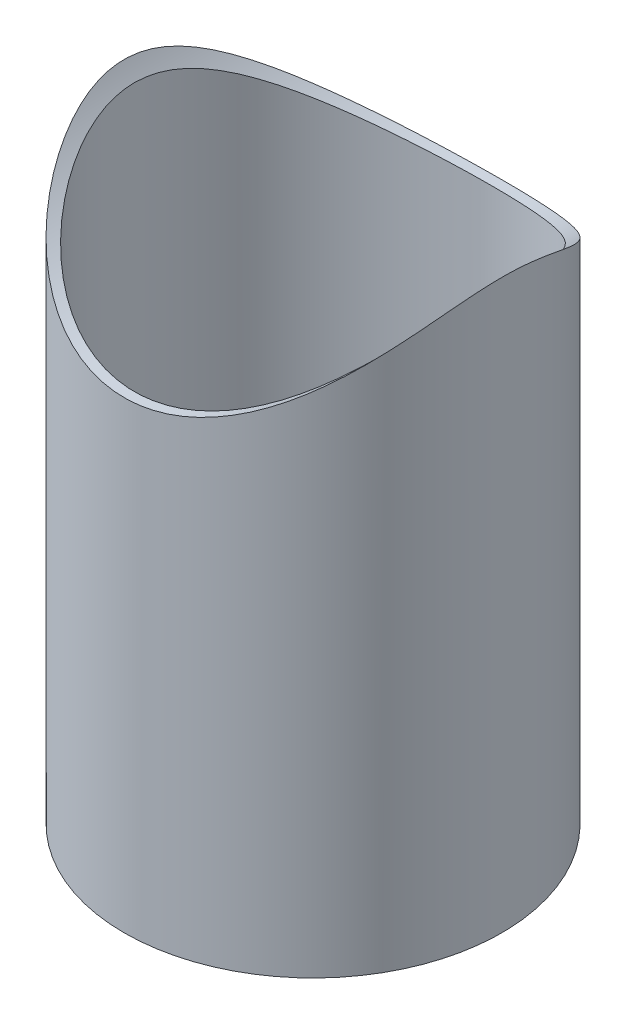
ISO-10303-21;
HEADER;
FILE_DESCRIPTION(('STEP AP214'),'2;1');
FILE_NAME('part.step','',(''),(''),'','','');
FILE_SCHEMA(('AUTOMOTIVE_DESIGN { 1 0 10303 214 1 1 1 1 }'));
ENDSEC;
DATA;
#1=APPLICATION_CONTEXT('core data for automotive mechanical design processes');
#2=APPLICATION_PROTOCOL_DEFINITION('international standard','automotive_design',2000,#1);
#3=PRODUCT_CONTEXT('',#1,'mechanical');
#4=PRODUCT('Part','Part','',(#3));
#5=PRODUCT_RELATED_PRODUCT_CATEGORY('part','',(#4));
#6=PRODUCT_DEFINITION_FORMATION('','',#4);
#7=PRODUCT_DEFINITION_CONTEXT('part definition',#1,'design');
#8=PRODUCT_DEFINITION('design','',#6,#7);
#9=PRODUCT_DEFINITION_SHAPE('','',#8);
#10=(LENGTH_UNIT() NAMED_UNIT(*) SI_UNIT(.MILLI.,.METRE.));
#11=(NAMED_UNIT(*) PLANE_ANGLE_UNIT() SI_UNIT($,.RADIAN.));
#12=(NAMED_UNIT(*) SI_UNIT($,.STERADIAN.) SOLID_ANGLE_UNIT());
#13=UNCERTAINTY_MEASURE_WITH_UNIT(LENGTH_MEASURE(1.E-05),#10,'distance_accuracy_value','');
#14=(GEOMETRIC_REPRESENTATION_CONTEXT(3) GLOBAL_UNCERTAINTY_ASSIGNED_CONTEXT((#13)) GLOBAL_UNIT_ASSIGNED_CONTEXT((#10,
#11,#12)) REPRESENTATION_CONTEXT('',''));
#15=CARTESIAN_POINT('',(0.,0.,0.));
#16=DIRECTION('',(0.,0.,1.));
#17=DIRECTION('',(1.,0.,0.));
#18=AXIS2_PLACEMENT_3D('',#15,#16,#17);
#19=CARTESIAN_POINT('',(0.,200.,0.));
#20=DIRECTION('',(0.,-1.,0.));
#21=DIRECTION('',(0.,0.,-1.));
#22=AXIS2_PLACEMENT_3D('',#19,#20,#21);
#23=CYLINDRICAL_SURFACE('',#22,55.);
#24=CARTESIAN_POINT('',(0.,135.,-55.));
#25=CARTESIAN_POINT('',(0.649687984992987,134.999999930929,-55.0000000926449));
#26=CARTESIAN_POINT('',(1.29938341036194,135.009745585915,-54.9884835203489));
#27=CARTESIAN_POINT('',(2.59745079891205,135.048672604591,-54.942470642494));
#28=CARTESIAN_POINT('',(3.24582259036104,135.077856347155,-54.9079715242826));
#29=CARTESIAN_POINT('',(4.54001614705967,135.155504198764,-54.8161402980721));
#30=CARTESIAN_POINT('',(5.18583694312795,135.203975034706,-54.7588002236633));
#31=CARTESIAN_POINT('',(6.47342844229795,135.319920873904,-54.6215523570628));
#32=CARTESIAN_POINT('',(7.11519867716309,135.387398034557,-54.5416420029301));
#33=CARTESIAN_POINT('',(8.39437292394328,135.541097792042,-54.359474564406));
#34=CARTESIAN_POINT('',(9.0317682718971,135.627350310001,-54.2571818091987));
#35=CARTESIAN_POINT('',(10.299951578349,135.818051920441,-54.0307889340309));
#36=CARTESIAN_POINT('',(10.9307387929352,135.922503038785,-53.906686386197));
#37=CARTESIAN_POINT('',(12.811174199476,136.262296770625,-53.5024888777877));
#38=CARTESIAN_POINT('',(14.0494127963205,136.52414245144,-53.1904299493305));
#39=CARTESIAN_POINT('',(16.4785655768544,137.111137040586,-52.488530074335));
#40=CARTESIAN_POINT('',(17.6697381288622,137.43585681733,-52.0992159895204));
#41=CARTESIAN_POINT('',(20.0074466137368,138.14376804308,-51.2469486702097));
#42=CARTESIAN_POINT('',(21.1539824507714,138.526959617613,-50.7839952776255));
#43=CARTESIAN_POINT('',(23.3975292137013,139.34539073535,-49.7901704326261));
#44=CARTESIAN_POINT('',(24.4945487383163,139.780621193507,-49.2593108342782));
#45=CARTESIAN_POINT('',(26.6363547136821,140.696867486587,-48.1348918281424));
#46=CARTESIAN_POINT('',(27.6811298604858,141.177893165255,-47.5413189370225));
#47=CARTESIAN_POINT('',(29.3977400828417,142.022586149458,-46.4913428188428));
#48=CARTESIAN_POINT('',(30.0840417422323,142.375921134588,-46.050080547211));
#49=CARTESIAN_POINT('',(31.4303032486224,143.099036362002,-45.1419441062798));
#50=CARTESIAN_POINT('',(32.0902686091924,143.468813127522,-44.6750753468759));
#51=CARTESIAN_POINT('',(33.3839557976297,144.223012911788,-43.7168130731633));
#52=CARTESIAN_POINT('',(34.0176672594633,144.607441602789,-43.2254100375151));
#53=CARTESIAN_POINT('',(35.2584026818911,145.388803308988,-42.2194618594444));
#54=CARTESIAN_POINT('',(35.8654251439838,145.785737024161,-41.7049154208672));
#55=CARTESIAN_POINT('',(37.6492906960693,146.994376034597,-40.1255275508804));
#56=CARTESIAN_POINT('',(38.7860232104076,147.822206733439,-39.0271006703234));
#57=CARTESIAN_POINT('',(40.4100650641436,149.083429158116,-37.3181487498578));
#58=CARTESIAN_POINT('',(40.9379267193561,149.507103913498,-36.7382496198527));
#59=CARTESIAN_POINT('',(41.9668390292239,150.358986664023,-35.5583603711605));
#60=CARTESIAN_POINT('',(42.4678922176131,150.78719422616,-34.9583721598866));
#61=CARTESIAN_POINT('',(43.4526833086036,151.654336825908,-33.726814994887));
#62=CARTESIAN_POINT('',(43.9358950453101,152.093318547677,-33.0948588099637));
#63=CARTESIAN_POINT('',(44.8744648399211,152.971335152551,-31.8106107365733));
#64=CARTESIAN_POINT('',(45.3298227076239,153.410370035999,-31.1583187092878));
#65=CARTESIAN_POINT('',(46.2127327916096,154.285997680627,-29.8331604723272));
#66=CARTESIAN_POINT('',(46.6402753685946,154.722589547784,-29.1602872478168));
#67=CARTESIAN_POINT('',(47.4671758869425,155.59024515978,-27.7939717517379));
#68=CARTESIAN_POINT('',(47.8665341707893,156.021308971741,-27.1005297302585));
#69=CARTESIAN_POINT('',(48.6358647342957,156.873656688436,-25.6942333500024));
#70=CARTESIAN_POINT('',(49.0059005541708,157.294960257416,-24.9814257254015));
#71=CARTESIAN_POINT('',(49.7170595949343,158.125035371515,-23.5343154253339));
#72=CARTESIAN_POINT('',(50.0581812777678,158.533806249234,-22.8000116091932));
#73=CARTESIAN_POINT('',(50.7104972297632,159.334144999828,-21.309776784882));
#74=CARTESIAN_POINT('',(51.0217122020373,159.725724669934,-20.5538612148442));
#75=CARTESIAN_POINT('',(51.613374355413,160.486813862848,-19.0193495138553));
#76=CARTESIAN_POINT('',(51.8938270788582,160.856327355771,-18.2407575005472));
#77=CARTESIAN_POINT('',(52.4420927793597,161.593579934061,-16.6020262483409));
#78=CARTESIAN_POINT('',(52.7074600229864,161.959190692151,-15.7401004372349));
#79=CARTESIAN_POINT('',(53.1989739601385,162.649647750257,-13.9891316590003));
#80=CARTESIAN_POINT('',(53.4251255872957,162.974499176692,-13.1000921195634));
#81=CARTESIAN_POINT('',(53.8351576182025,163.57326024105,-11.2972776318347));
#82=CARTESIAN_POINT('',(54.0191185232752,163.84726669883,-10.3835535713789));
#83=CARTESIAN_POINT('',(54.3422959516675,164.334881390968,-8.53215030107312));
#84=CARTESIAN_POINT('',(54.4815124789616,164.548489630691,-7.59447109335102));
#85=CARTESIAN_POINT('',(54.7138036053771,164.908027574049,-5.68645934289734));
#86=CARTESIAN_POINT('',(54.8061998303719,165.052960402583,-4.71585279632698));
#87=CARTESIAN_POINT('',(54.93930081178,165.262571537931,-2.76245509336314));
#88=CARTESIAN_POINT('',(54.9800116318612,165.327259258982,-1.77966537994677));
#89=CARTESIAN_POINT('',(55.0084751638515,165.372432139168,0.188196653923133));
#90=CARTESIAN_POINT('',(54.9962525941352,165.35295660014,1.17326769431656));
#91=CARTESIAN_POINT('',(54.9192994461694,165.231112810195,3.1361893184346));
#92=CARTESIAN_POINT('',(54.8545634871348,165.128736064806,4.11403915187661));
#93=CARTESIAN_POINT('',(54.6703336470178,164.840578199356,6.09864737348195));
#94=CARTESIAN_POINT('',(54.5484417716551,164.651152682689,7.10464615367857));
#95=CARTESIAN_POINT('',(54.2526133447842,164.198791761486,9.09197095388173));
#96=CARTESIAN_POINT('',(54.0786702422936,163.935847104366,10.0732938514072));
#97=CARTESIAN_POINT('',(53.681868308189,163.347811328419,12.0098748794838));
#98=CARTESIAN_POINT('',(53.4588716858674,163.022545488974,12.9650508908919));
#99=CARTESIAN_POINT('',(52.9675718902619,162.322165966914,14.8452369191923));
#100=CARTESIAN_POINT('',(52.6992503428288,161.947032081618,15.7702345199656));
#101=CARTESIAN_POINT('',(52.1753075903611,161.232816334555,17.416510886191));
#102=CARTESIAN_POINT('',(51.9269782429803,160.900449014116,18.1430731434705));
#103=CARTESIAN_POINT('',(51.4037620570903,160.215090481265,19.5763927736807));
#104=CARTESIAN_POINT('',(51.1288811392323,159.86210387359,20.2831545167287));
#105=CARTESIAN_POINT('',(50.5532776312992,159.139509797424,21.6780011873878));
#106=CARTESIAN_POINT('',(50.2525383598995,158.769891674273,22.3660736761737));
#107=CARTESIAN_POINT('',(49.626065791255,158.017943152456,23.7236695734822));
#108=CARTESIAN_POINT('',(49.3003311016431,157.635612046289,24.3931919458409));
#109=CARTESIAN_POINT('',(48.623949596075,156.860965505391,25.7150434134017));
#110=CARTESIAN_POINT('',(48.2732697850259,156.468637304496,26.367348111174));
#111=CARTESIAN_POINT('',(47.5477619556378,155.677336742454,27.6542205087475));
#112=CARTESIAN_POINT('',(47.1729344040535,155.278364509841,28.2887885510431));
#113=CARTESIAN_POINT('',(46.399469689379,154.476385242909,29.5403147812793));
#114=CARTESIAN_POINT('',(46.0008389391666,154.073379319453,30.1572776466657));
#115=CARTESIAN_POINT('',(45.1797811590967,153.265439388125,31.3739706626308));
#116=CARTESIAN_POINT('',(44.7573517856633,152.860505193973,31.9736991072328));
#117=CARTESIAN_POINT('',(43.8602980018059,152.024229662052,33.1946556623467));
#118=CARTESIAN_POINT('',(43.3840675279777,151.592899133041,33.8147121484806));
#119=CARTESIAN_POINT('',(42.4047229512643,150.732726396931,35.0350041044574));
#120=CARTESIAN_POINT('',(41.9016088745786,150.303884187407,35.6352395936161));
#121=CARTESIAN_POINT('',(40.8683954603829,149.450784835718,36.8156153527884));
#122=CARTESIAN_POINT('',(40.3382921511321,149.026528379594,37.3957526439151));
#123=CARTESIAN_POINT('',(39.251123108983,148.184732069061,38.5353014680411));
#124=CARTESIAN_POINT('',(38.6940569924405,147.767192310332,39.0947127059368));
#125=CARTESIAN_POINT('',(37.5538512398668,146.941514168012,40.1912033942878));
#126=CARTESIAN_POINT('',(36.9707546594091,146.533361836648,40.7283170784991));
#127=CARTESIAN_POINT('',(35.7777120485169,145.727784486295,41.7802315188984));
#128=CARTESIAN_POINT('',(35.1677677665009,145.33035877146,42.2950337237692));
#129=CARTESIAN_POINT('',(33.9212598377917,144.548316024042,43.301147644347));
#130=CARTESIAN_POINT('',(33.2847049938593,144.163694830185,43.7924670146817));
#131=CARTESIAN_POINT('',(31.9848331575292,143.409051402836,44.7506715651381));
#132=CARTESIAN_POINT('',(31.3215095796636,143.039032806611,45.2175506669276));
#133=CARTESIAN_POINT('',(29.5748824279636,142.105282442182,46.3895121752436));
#134=CARTESIAN_POINT('',(28.4717044772346,141.554056530097,47.0751981373403));
#135=CARTESIAN_POINT('',(26.2014937508764,140.501713446293,48.3755294445427));
#136=CARTESIAN_POINT('',(25.0344753087917,140.000585097471,48.9901906405428));
#137=CARTESIAN_POINT('',(23.2388988121384,139.292768879571,49.8537359081388));
#138=CARTESIAN_POINT('',(22.6328324425032,139.064132094982,50.1318562030298));
#139=CARTESIAN_POINT('',(21.4062493829657,138.622502846132,50.6677433597635));
#140=CARTESIAN_POINT('',(20.7857350314801,138.409507873096,50.9255134860492));
#141=CARTESIAN_POINT('',(19.530828287219,138.00014168566,51.4198563270945));
#142=CARTESIAN_POINT('',(18.8964341148236,137.803772618878,51.6564263035968));
#143=CARTESIAN_POINT('',(17.6146918276211,137.428692812162,52.1074290720417));
#144=CARTESIAN_POINT('',(16.9673440188875,137.249981655591,52.3218623863024));
#145=CARTESIAN_POINT('',(15.654721556041,136.909639788761,52.7295577662699));
#146=CARTESIAN_POINT('',(14.9893374585955,136.748179031837,52.9226097589647));
#147=CARTESIAN_POINT('',(13.6476076331259,136.445175338578,53.2843833056507));
#148=CARTESIAN_POINT('',(12.9712634990334,136.303629534468,53.4531083628331));
#149=CARTESIAN_POINT('',(11.6087011253588,136.041267398405,53.7654783611025));
#150=CARTESIAN_POINT('',(10.9224812874604,135.920454463765,53.9091191919235));
#151=CARTESIAN_POINT('',(9.54179537039117,135.700367392421,54.1705430062947));
#152=CARTESIAN_POINT('',(8.84733034600363,135.601090531324,54.2883292605659));
#153=CARTESIAN_POINT('',(7.4520684462637,135.424766326592,54.4973756791653));
#154=CARTESIAN_POINT('',(6.75127587675071,135.347704891653,54.5886526586699));
#155=CARTESIAN_POINT('',(5.34468328314211,135.216257730787,54.7442690621251));
#156=CARTESIAN_POINT('',(4.63888393041409,135.161869020981,54.8086120307724));
#157=CARTESIAN_POINT('',(3.22395348656202,135.076134278249,54.9100089401845));
#158=CARTESIAN_POINT('',(2.514822573013,135.044787030907,54.9470643191603));
#159=CARTESIAN_POINT('',(1.09508649550507,135.005343571329,54.9936858897516));
#160=CARTESIAN_POINT('',(0.38448138634033,134.997246509874,55.0032530853804));
#161=CARTESIAN_POINT('',(-1.5505259796771,135.006972191135,54.9917619221442));
#162=CARTESIAN_POINT('',(-2.77483786266464,135.047775708681,54.9435505627072));
#163=CARTESIAN_POINT('',(-5.21301850443081,135.197863476363,54.7660394944585));
#164=CARTESIAN_POINT('',(-6.42688840173863,135.307140162157,54.6367487426165));
#165=CARTESIAN_POINT('',(-8.83572258046039,135.591919847431,54.2992540584982));
#166=CARTESIAN_POINT('',(-10.0306867168894,135.767423354536,54.0910495213516));
#167=CARTESIAN_POINT('',(-12.3938100387912,136.181251211939,53.5989776180277));
#168=CARTESIAN_POINT('',(-13.5619681231911,136.419578137737,53.3151071498528));
#169=CARTESIAN_POINT('',(-15.8516450002449,136.951674976446,52.6794188512357));
#170=CARTESIAN_POINT('',(-16.9735424802315,137.24478546446,52.3284081139334));
#171=CARTESIAN_POINT('',(-19.1792106645202,137.883366467024,51.5608523514634));
#172=CARTESIAN_POINT('',(-20.2629828971563,138.228834879738,51.1443099569471));
#173=CARTESIAN_POINT('',(-22.3885664671887,138.967071796699,50.2501935293978));
#174=CARTESIAN_POINT('',(-23.4303694540098,139.35984965263,49.772607428675));
#175=CARTESIAN_POINT('',(-25.4690524018154,140.187476893335,48.7608718676468));
#176=CARTESIAN_POINT('',(-26.46592324301,140.622334763146,48.2267109975134));
#177=CARTESIAN_POINT('',(-28.1385962148448,141.401237609576,47.2638439695312));
#178=CARTESIAN_POINT('',(-28.8258480273699,141.736427795638,46.8477290717021));
#179=CARTESIAN_POINT('',(-30.1753144713023,142.423756839421,45.9901017076533));
#180=CARTESIAN_POINT('',(-30.8375336778769,142.775892573028,45.5485939200079));
#181=CARTESIAN_POINT('',(-32.7868080540558,143.855266308104,44.1875270916915));
#182=CARTESIAN_POINT('',(-34.0361863392249,144.605332676025,43.2315945696784));
#183=CARTESIAN_POINT('',(-36.4348734516364,146.152597828423,41.2304072446877));
#184=CARTESIAN_POINT('',(-37.583951182396,146.949898704309,40.1849566155335));
#185=CARTESIAN_POINT('',(-39.7790725030482,148.575403082736,38.0132694917532));
#186=CARTESIAN_POINT('',(-40.8251287347363,149.403602776434,36.8870429385477));
#187=CARTESIAN_POINT('',(-42.3261520972851,150.665071802552,35.1298268672946));
#188=CARTESIAN_POINT('',(-42.8193025026823,151.092725738569,34.5269877798857));
#189=CARTESIAN_POINT('',(-43.7789733957533,151.949868090205,33.3017569484235));
#190=CARTESIAN_POINT('',(-44.2454958257804,152.379356369556,32.679366635664));
#191=CARTESIAN_POINT('',(-45.1520108434491,153.237987375309,31.4149841408783));
#192=CARTESIAN_POINT('',(-45.5919956356156,153.66712996399,30.7729862817256));
#193=CARTESIAN_POINT('',(-46.4451858393746,154.522428221674,29.4695006037013));
#194=CARTESIAN_POINT('',(-46.8583914934964,154.948583917697,28.8080129614208));
#195=CARTESIAN_POINT('',(-47.6571915924121,155.79445806324,27.466355585513));
#196=CARTESIAN_POINT('',(-48.0428279862442,156.214185494698,26.7862165120752));
#197=CARTESIAN_POINT('',(-48.7868620792168,157.044756627082,25.405843437986));
#198=CARTESIAN_POINT('',(-49.1452587284877,157.455599985164,24.705608664241));
#199=CARTESIAN_POINT('',(-49.8340976107132,158.264586187344,23.2848801729695));
#200=CARTESIAN_POINT('',(-50.1645540812911,158.662735434823,22.5643970259658));
#201=CARTESIAN_POINT('',(-50.7969262302645,159.442334970467,21.1022892842927));
#202=CARTESIAN_POINT('',(-51.0988456153796,159.823787423934,20.3606674516876));
#203=CARTESIAN_POINT('',(-51.7173095281613,160.622184537481,18.7398896858691));
#204=CARTESIAN_POINT('',(-52.0289788270785,161.035582798757,17.8571038109098));
#205=CARTESIAN_POINT('',(-52.6109728454683,161.825059452033,16.0616301570104));
#206=CARTESIAN_POINT('',(-52.8813001463813,162.201140173667,15.1489442493863));
#207=CARTESIAN_POINT('',(-53.3775125160622,162.905170293515,13.2951190093294));
#208=CARTESIAN_POINT('',(-53.6034730580087,163.233201184466,12.3540311951137));
#209=CARTESIAN_POINT('',(-54.008238391197,163.830391179439,10.4433274066731));
#210=CARTESIAN_POINT('',(-54.1870518548593,164.099561109023,9.47371671558427));
#211=CARTESIAN_POINT('',(-54.4698306123508,164.530390604502,7.66414578022683));
#212=CARTESIAN_POINT('',(-54.5811453042148,164.702301664104,6.82778490106962));
#213=CARTESIAN_POINT('',(-54.7657506558717,164.989403348471,5.14118932334446));
#214=CARTESIAN_POINT('',(-54.8390458744327,165.104600773465,4.29095630074767));
#215=CARTESIAN_POINT('',(-54.9459799610312,165.273218120098,2.58276928660831));
#216=CARTESIAN_POINT('',(-54.9796619840547,165.326705268281,1.72482472511913));
#217=CARTESIAN_POINT('',(-55.0067096189903,165.36962916057,0.00666642298614568));
#218=CARTESIAN_POINT('',(-55.0000748908792,165.359065364482,-0.853547336734438));
#219=CARTESIAN_POINT('',(-54.9466733987578,165.274425852963,-2.56881163233851));
#220=CARTESIAN_POINT('',(-54.8999406933183,165.200404037787,-3.42386593006711));
#221=CARTESIAN_POINT('',(-54.7674781487508,164.99230948769,-5.12348714163929));
#222=CARTESIAN_POINT('',(-54.6817475448538,164.858235575117,-5.9680538494821));
#223=CARTESIAN_POINT('',(-54.4728840752113,164.535345486281,-7.64320612441843));
#224=CARTESIAN_POINT('',(-54.3496936416962,164.346445073862,-8.47376808093944));
#225=CARTESIAN_POINT('',(-54.0680504051632,163.920767612295,-10.1163576822999));
#226=CARTESIAN_POINT('',(-53.9095927256599,163.683983942629,-10.9283827468628));
#227=CARTESIAN_POINT('',(-53.4575610341473,163.019859153099,-12.9990617462658));
#228=CARTESIAN_POINT('',(-53.1390341547452,162.561837597344,-14.2424859336938));
#229=CARTESIAN_POINT('',(-52.4262467228865,161.570043449388,-16.6763024617869));
#230=CARTESIAN_POINT('',(-52.0319392497618,161.036223979557,-17.8666613808192));
#231=CARTESIAN_POINT('',(-51.1717387684896,159.913153950216,-20.1990825111066));
#232=CARTESIAN_POINT('',(-50.7056184306942,159.323729750313,-21.3409761249403));
#233=CARTESIAN_POINT('',(-49.706435579245,158.10860460565,-23.5747161170811));
#234=CARTESIAN_POINT('',(-49.1733787944352,157.482906767881,-24.6665667674781));
#235=CARTESIAN_POINT('',(-48.1961471569936,156.38215001142,-26.5123686431482));
#236=CARTESIAN_POINT('',(-47.7671451825292,155.912325072692,-27.2775621634224));
#237=CARTESIAN_POINT('',(-46.8752438935084,154.965185117021,-28.7832814799057));
#238=CARTESIAN_POINT('',(-46.4123419139283,154.487869513526,-29.5238053300548));
#239=CARTESIAN_POINT('',(-45.452790339795,153.529537154047,-30.9807190966422));
#240=CARTESIAN_POINT('',(-44.9561271529625,153.048518977346,-31.6970991170596));
#241=CARTESIAN_POINT('',(-43.9293648994323,152.086475342967,-33.1054417482998));
#242=CARTESIAN_POINT('',(-43.3992667569676,151.605449885858,-33.7974050332437));
#243=CARTESIAN_POINT('',(-42.3063119171219,150.647152272291,-35.1558674440198));
#244=CARTESIAN_POINT('',(-41.7434956708736,150.169876275784,-35.8223963943522));
#245=CARTESIAN_POINT('',(-40.5844785137557,149.221452792438,-37.130360007689));
#246=CARTESIAN_POINT('',(-39.9882769100143,148.750305433043,-37.7717941494122));
#247=CARTESIAN_POINT('',(-38.7626893892383,147.817178851585,-39.0285008183889));
#248=CARTESIAN_POINT('',(-38.1333173890136,147.355195894777,-39.6437841246873));
#249=CARTESIAN_POINT('',(-36.8411543144454,146.442974588028,-40.8473867749349));
#250=CARTESIAN_POINT('',(-36.1783620127959,145.992736670327,-41.4357051271235));
#251=CARTESIAN_POINT('',(-34.4525258180371,144.867586709047,-42.8940535632524));
#252=CARTESIAN_POINT('',(-33.3665098624788,144.202551772391,-43.7447736603054));
#253=CARTESIAN_POINT('',(-31.1160894128394,142.917005321406,-45.3730943051902));
#254=CARTESIAN_POINT('',(-29.9516879258718,142.29649210097,-46.1506976552685));
#255=CARTESIAN_POINT('',(-27.5474178840058,141.110828742226,-47.6248473084519));
#256=CARTESIAN_POINT('',(-26.3076206306438,140.545627576076,-48.3214684349342));
#257=CARTESIAN_POINT('',(-23.7553482277233,139.480628840082,-49.6259621058276));
#258=CARTESIAN_POINT('',(-22.4428880833435,138.980817838071,-50.2338528798231));
#259=CARTESIAN_POINT('',(-19.9805100128322,138.135848026094,-51.2566232712522));
#260=CARTESIAN_POINT('',(-18.8409702316145,137.778847237588,-51.6867428323704));
#261=CARTESIAN_POINT('',(-16.5206383849181,137.122964781758,-52.4744622107925));
#262=CARTESIAN_POINT('',(-15.3398459743807,136.824083600715,-52.8320614213275));
#263=CARTESIAN_POINT('',(-12.945689278567,136.290422737511,-53.4690604067229));
#264=CARTESIAN_POINT('',(-11.732393379171,136.055518549584,-53.7486120970429));
#265=CARTESIAN_POINT('',(-9.27921277259581,135.65374753946,-54.2259793927452));
#266=CARTESIAN_POINT('',(-8.03933971440961,135.486851525577,-54.4238300677888));
#267=CARTESIAN_POINT('',(-5.668532639751,135.237819770407,-54.7187862074272));
#268=CARTESIAN_POINT('',(-4.53935149490357,135.148787224703,-54.8240945315397));
#269=CARTESIAN_POINT('',(-2.84018555215121,135.059599394709,-54.9295541135715));
#270=CARTESIAN_POINT('',(-2.27281777024746,135.03726359607,-54.95595684274));
#271=CARTESIAN_POINT('',(-1.13696872785982,135.007461959288,-54.9911820740642));
#272=CARTESIAN_POINT('',(-0.568487212301304,135.000000060438,-54.9999999189343));
#273=CARTESIAN_POINT('',(0.,135.,-55.));
#274=B_SPLINE_CURVE_WITH_KNOTS('',3,(#24,#25,#26,#27,#28,#29,#30,#31,#32,#33,#34,#35,#36,#37,
#38,#39,#40,#41,#42,#43,#44,#45,#46,#47,#48,#49,#50,#51,#52,#53,#54,#55,#56,#57,#58,#59,#60,#61,
#62,#63,#64,#65,#66,#67,#68,#69,#70,#71,#72,#73,#74,#75,#76,#77,#78,#79,#80,#81,#82,#83,#84,#85,
#86,#87,#88,#89,#90,#91,#92,#93,#94,#95,#96,#97,#98,#99,#100,#101,#102,#103,#104,#105,#106,#107,
#108,#109,#110,#111,#112,#113,#114,#115,#116,#117,#118,#119,#120,#121,#122,#123,#124,#125,#126,
#127,#128,#129,#130,#131,#132,#133,#134,#135,#136,#137,#138,#139,#140,#141,#142,#143,#144,#145,
#146,#147,#148,#149,#150,#151,#152,#153,#154,#155,#156,#157,#158,#159,#160,#161,#162,#163,#164,
#165,#166,#167,#168,#169,#170,#171,#172,#173,#174,#175,#176,#177,#178,#179,#180,#181,#182,#183,
#184,#185,#186,#187,#188,#189,#190,#191,#192,#193,#194,#195,#196,#197,#198,#199,#200,#201,#202,
#203,#204,#205,#206,#207,#208,#209,#210,#211,#212,#213,#214,#215,#216,#217,#218,#219,#220,#221,
#222,#223,#224,#225,#226,#227,#228,#229,#230,#231,#232,#233,#234,#235,#236,#237,#238,#239,#240,
#241,#242,#243,#244,#245,#246,#247,#248,#249,#250,#251,#252,#253,#254,#255,#256,#257,#258,#259,
#260,#261,#262,#263,#264,#265,#266,#267,#268,#269,#270,#271,#272,#273),.UNSPECIFIED.,.T.,.F.,(4,
2,2,2,2,2,2,2,2,2,2,2,2,2,2,2,2,2,2,2,2,2,2,2,2,2,2,2,2,2,2,2,2,2,2,2,2,2,2,2,2,2,2,2,2,2,2,2,2,
2,2,2,2,2,2,2,2,2,2,2,2,2,2,2,2,2,2,2,2,2,2,2,2,2,2,2,2,2,2,2,2,2,2,2,2,2,2,2,2,2,2,2,2,2,2,2,2,
2,2,2,2,2,2,2,2,2,2,2,2,2,2,2,2,2,2,2,2,2,2,2,2,2,2,2,4),(0.,1.9489020677354,3.89804269004297,
5.84786372464205,7.79790617144292,9.75107933369411,11.7044700617189,15.6096800533035,
19.4891200877851,23.3685684507202,27.2473405184085,31.1269482240665,33.7935089192582,
36.4595084027948,39.1265506822856,41.7937425168936,47.1401180393291,49.8135675699406,
52.4867639783409,55.2119419934023,57.9371386154117,60.6632746694042,63.3893775908128,
66.1094017574775,68.8295705220882,71.5478424586031,74.2656238448741,77.1832447104655,
80.1004982497668,83.0121383836084,85.9237782588151,88.8764777983892,91.8288308988801,
94.7798054838613,97.7310824786939,100.819092952283,103.907492235462,107.004680164236,
110.103126680178,112.612226073153,115.120767255915,117.630939027346,120.141250729263,
122.654946899584,125.168594496917,127.681567915312,130.19478923348,132.872928623421,
135.551065403422,138.229597444179,140.908167608025,143.582460536137,146.25657956167,
148.929820883461,151.6037239163,155.832853443348,160.061037307462,162.175349441259,
164.289321718628,166.403566648882,168.517761681793,170.651167000953,172.78426479237,
174.917711782894,177.050888726978,179.18270959914,181.314249821089,183.445677690714,
185.577027708366,189.249807531295,192.922181687843,196.594583993534,200.267136876055,
203.898039772141,207.52879694928,211.160273001749,214.792482838942,217.40318137278,
220.01340042359,225.234933665419,230.468196347003,235.700816051305,238.365934189765,
241.030857674542,243.696560210202,246.36223860016,249.023770569285,251.685405066766,
254.345674982597,257.005598876254,260.074035278946,263.142280006742,266.205259180313,
269.267674543678,271.848336669211,274.42868928595,277.006228230831,279.583788914175,
282.159162424166,284.734586440743,287.313988510725,289.893747462553,293.975522872496,
298.059833763566,302.157350120888,306.254516025593,309.239066344349,312.223851543697,
315.209845618865,318.195757189196,321.178052546726,324.160409821054,327.141525641413,
330.12275101822,334.71283183242,339.302736657046,343.888366362494,348.473052623681,
352.277047441814,356.081074086185,359.87764393094,363.672582423057,367.081361154207,
368.786229669601,370.491549652619),.UNSPECIFIED.);
#275=CARTESIAN_POINT('',(0.,135.,-55.));
#276=VERTEX_POINT('',#275);
#277=EDGE_CURVE('E57',#276,#276,#274,.T.);
#278=ORIENTED_EDGE('',*,*,#277,.T.);
#279=EDGE_LOOP('',(#278));
#280=FACE_BOUND('',#279,.T.);
#281=CARTESIAN_POINT('',(0.,0.,0.));
#282=DIRECTION('',(0.,1.,0.));
#283=DIRECTION('',(0.,0.,1.));
#284=AXIS2_PLACEMENT_3D('',#281,#282,#283);
#285=CIRCLE('',#284,55.);
#286=CARTESIAN_POINT('',(0.,0.,55.));
#287=VERTEX_POINT('',#286);
#288=EDGE_CURVE('E10',#287,#287,#285,.T.);
#289=ORIENTED_EDGE('',*,*,#288,.T.);
#290=EDGE_LOOP('',(#289));
#291=FACE_BOUND('',#290,.T.);
#292=ADVANCED_FACE('F39',(#280,#291),#23,.T.);
#293=CARTESIAN_POINT('',(0.,0.,0.));
#294=DIRECTION('',(0.,1.,0.));
#295=DIRECTION('',(0.,0.,1.));
#296=AXIS2_PLACEMENT_3D('',#293,#294,#295);
#297=PLANE('',#296);
#298=CARTESIAN_POINT('',(0.,0.,0.));
#299=DIRECTION('',(0.,1.,0.));
#300=DIRECTION('',(0.,0.,1.));
#301=AXIS2_PLACEMENT_3D('',#298,#299,#300);
#302=CIRCLE('',#301,52.);
#303=CARTESIAN_POINT('',(0.,0.,52.));
#304=VERTEX_POINT('',#303);
#305=EDGE_CURVE('E55',#304,#304,#302,.T.);
#306=ORIENTED_EDGE('',*,*,#305,.T.);
#307=EDGE_LOOP('',(#306));
#308=FACE_BOUND('',#307,.T.);
#309=ORIENTED_EDGE('',*,*,#288,.F.);
#310=EDGE_LOOP('',(#309));
#311=FACE_BOUND('',#310,.T.);
#312=ADVANCED_FACE('F71',(#308,#311),#297,.F.);
#313=CARTESIAN_POINT('',(0.,200.,0.));
#314=DIRECTION('',(0.,-1.,0.));
#315=DIRECTION('',(0.,0.,-1.));
#316=AXIS2_PLACEMENT_3D('',#313,#314,#315);
#317=CYLINDRICAL_SURFACE('',#316,52.);
#318=CARTESIAN_POINT('',(0.,135.,-52.));
#319=CARTESIAN_POINT('',(0.624300823280926,135.000000470147,-51.9999995253166));
#320=CARTESIAN_POINT('',(1.24862384420058,135.008999297107,-51.9887522235436));
#321=CARTESIAN_POINT('',(2.49601683855717,135.044943947894,-51.9438108458454));
#322=CARTESIAN_POINT('',(3.11908662718966,135.071892248165,-51.9101136725691));
#323=CARTESIAN_POINT('',(4.36284141224746,135.143591137314,-51.8204061991872));
#324=CARTESIAN_POINT('',(4.98352536149963,135.188348803093,-51.7643870289853));
#325=CARTESIAN_POINT('',(6.22104778590553,135.295406885252,-51.6302817919737));
#326=CARTESIAN_POINT('',(6.83788581837839,135.357709284344,-51.5521932311206));
#327=CARTESIAN_POINT('',(8.06754203664422,135.499624561354,-51.374131008506));
#328=CARTESIAN_POINT('',(8.68035102298481,135.579268300864,-51.2741183272066));
#329=CARTESIAN_POINT('',(9.89968526455689,135.755342990243,-51.0527220012369));
#330=CARTESIAN_POINT('',(10.5062098198637,135.851775789137,-50.9313360026495));
#331=CARTESIAN_POINT('',(12.3144141014324,136.165445835585,-50.5358914867475));
#332=CARTESIAN_POINT('',(13.5052366015082,136.407114445065,-50.2304717905656));
#333=CARTESIAN_POINT('',(15.8419141121981,136.948719521511,-49.5429955910053));
#334=CARTESIAN_POINT('',(16.9880084349278,137.248272563579,-49.1614428763493));
#335=CARTESIAN_POINT('',(19.237524797831,137.900973566029,-48.3255344180809));
#336=CARTESIAN_POINT('',(20.3409465711097,138.254121861553,-47.8711782192118));
#337=CARTESIAN_POINT('',(22.5002257095834,139.007807608127,-46.8950286137886));
#338=CARTESIAN_POINT('',(23.5560948752113,139.408333211776,-46.3732520636942));
#339=CARTESIAN_POINT('',(25.6175975507797,140.250701305922,-45.2670664279278));
#340=CARTESIAN_POINT('',(26.6232207222364,140.692552246138,-44.682644529686));
#341=CARTESIAN_POINT('',(28.2626587324421,141.461514402267,-43.6558048522394));
#342=CARTESIAN_POINT('',(28.9109060070119,141.779131585417,-43.229122434902));
#343=CARTESIAN_POINT('',(30.1828668657374,142.428269308582,-42.3508168482999));
#344=CARTESIAN_POINT('',(30.8065856379748,142.759786877508,-41.8991990022979));
#345=CARTESIAN_POINT('',(32.0294991041905,143.435000349446,-40.9719446750249));
#346=CARTESIAN_POINT('',(32.6286846760896,143.778700695281,-40.4962994039664));
#347=CARTESIAN_POINT('',(33.8020400871943,144.476237635516,-39.5221910056422));
#348=CARTESIAN_POINT('',(34.3762085046916,144.830074804097,-39.0237265848717));
#349=CARTESIAN_POINT('',(36.0639028514932,145.905854238909,-37.4927524117629));
#350=CARTESIAN_POINT('',(37.1396785311646,146.640424667049,-36.4268973682185));
#351=CARTESIAN_POINT('',(38.6763121164425,147.754961710702,-34.7665300999344));
#352=CARTESIAN_POINT('',(39.1757135451103,148.128611169791,-34.2027733879284));
#353=CARTESIAN_POINT('',(40.1488857927889,148.878146625023,-33.0549989503016));
#354=CARTESIAN_POINT('',(40.6226590483405,149.254032404767,-32.4709831594627));
#355=CARTESIAN_POINT('',(41.5516578320753,150.011754268982,-31.2736776871815));
#356=CARTESIAN_POINT('',(42.0064754231016,150.393591128597,-30.660072373626));
#357=CARTESIAN_POINT('',(42.8893155033269,151.154874180581,-29.4124228548613));
#358=CARTESIAN_POINT('',(43.317337825262,151.534320358012,-28.778378522103));
#359=CARTESIAN_POINT('',(44.1464159080529,152.288282178196,-27.4896566573653));
#360=CARTESIAN_POINT('',(44.5474623486762,152.662796081259,-26.8349721077188));
#361=CARTESIAN_POINT('',(45.3219862690029,153.40381153263,-25.5050909908026));
#362=CARTESIAN_POINT('',(45.6954645067938,153.770313301067,-24.8298949882907));
#363=CARTESIAN_POINT('',(46.4132930926406,154.491053749105,-23.4606504419856));
#364=CARTESIAN_POINT('',(46.7577201331001,154.845323159057,-22.7666583618236));
#365=CARTESIAN_POINT('',(47.4178199813834,155.539010553425,-21.3577979424617));
#366=CARTESIAN_POINT('',(47.7334913543337,155.878427796297,-20.6429285638573));
#367=CARTESIAN_POINT('',(48.3348462948575,156.53804349291,-19.192664838056));
#368=CARTESIAN_POINT('',(48.6205510273922,156.858255441664,-18.457285447834));
#369=CARTESIAN_POINT('',(49.1609223220163,157.475044670826,-16.9656374925552));
#370=CARTESIAN_POINT('',(49.4155944624866,157.771626195683,-16.2093727119007));
#371=CARTESIAN_POINT('',(49.9282274219909,158.378459550869,-14.5610598402647));
#372=CARTESIAN_POINT('',(50.180954382133,158.684091893925,-13.6656565198709));
#373=CARTESIAN_POINT('',(50.6407175519761,159.248920416823,-11.8488583391842));
#374=CARTESIAN_POINT('',(50.8477610087885,159.508123960779,-10.9274676276561));
#375=CARTESIAN_POINT('',(51.2128616601575,159.97088933467,-9.0632628676461));
#376=CARTESIAN_POINT('',(51.3710219350621,160.174568141482,-8.12049846199571));
#377=CARTESIAN_POINT('',(51.6360529828369,160.518795837196,-6.21625559427989));
#378=CARTESIAN_POINT('',(51.7429243806241,160.659345495277,-5.25477736037709));
#379=CARTESIAN_POINT('',(51.9037259677036,160.871731498906,-3.31096497424532));
#380=CARTESIAN_POINT('',(51.9571735967318,160.942941373671,-2.32852116668553));
#381=CARTESIAN_POINT('',(52.008079643102,161.010751098239,-0.359622948838293));
#382=CARTESIAN_POINT('',(52.0055408231561,161.007354629572,0.626831261149784));
#383=CARTESIAN_POINT('',(51.944523705193,160.926109105377,2.59560339827418));
#384=CARTESIAN_POINT('',(51.8860048239774,160.848206035694,3.57791780527272));
#385=CARTESIAN_POINT('',(51.7144497736142,160.621890060845,5.52954107819437));
#386=CARTESIAN_POINT('',(51.6014059828073,160.473467298263,6.49884810643101));
#387=CARTESIAN_POINT('',(51.3015290676375,160.084810630233,8.5679671088492));
#388=CARTESIAN_POINT('',(51.1059209440128,159.833848607366,9.66448209072094));
#389=CARTESIAN_POINT('',(50.6497683884364,159.260158485031,11.82457765898));
#390=CARTESIAN_POINT('',(50.3892099408361,158.93741489742,12.8881510811348));
#391=CARTESIAN_POINT('',(49.8070554125699,158.233191711033,14.9813379289752));
#392=CARTESIAN_POINT('',(49.4853101112498,157.851568958063,16.0108609536434));
#393=CARTESIAN_POINT('',(48.7851270224518,157.043077593509,18.032070553475));
#394=CARTESIAN_POINT('',(48.4066847029582,156.616205365756,19.0237540960219));
#395=CARTESIAN_POINT('',(47.6993794438097,155.84153272822,20.7216397495619));
#396=CARTESIAN_POINT('',(47.3823925328457,155.501239943073,21.4362926090113));
#397=CARTESIAN_POINT('',(46.7195871383028,154.805853860465,22.8448255112248));
#398=CARTESIAN_POINT('',(46.3737657697803,154.450759083816,23.5387034659575));
#399=CARTESIAN_POINT('',(45.6539664326417,153.729327467348,24.9060744340026));
#400=CARTESIAN_POINT('',(45.2799776849238,153.362986355873,25.5795595037105));
#401=CARTESIAN_POINT('',(44.5045485941471,152.622446470486,26.9060465311347));
#402=CARTESIAN_POINT('',(44.103109034173,152.248247920932,27.5590490723784));
#403=CARTESIAN_POINT('',(43.2727296322523,151.494477975876,28.8454083584019));
#404=CARTESIAN_POINT('',(42.8437594801494,151.114901029896,29.4787422701249));
#405=CARTESIAN_POINT('',(41.958985898681,150.353406727342,30.7250315004411));
#406=CARTESIAN_POINT('',(41.5031800241871,149.971489160351,31.3379849540888));
#407=CARTESIAN_POINT('',(40.5650790577998,149.207873807354,32.5431613360347));
#408=CARTESIAN_POINT('',(40.0827894946698,148.826175992158,33.1353885492155));
#409=CARTESIAN_POINT('',(39.0917861612149,148.065208607809,34.2989244502618));
#410=CARTESIAN_POINT('',(38.5830724850311,147.68593903001,34.8702332126409));
#411=CARTESIAN_POINT('',(37.5253381586462,146.921887981606,36.0064925195808));
#412=CARTESIAN_POINT('',(36.9756025359337,146.537231339974,36.5708619749238));
#413=CARTESIAN_POINT('',(35.8484984945422,145.77502418971,37.6763622769151));
#414=CARTESIAN_POINT('',(35.2711297063328,145.397473776201,38.2174928126124));
#415=CARTESIAN_POINT('',(34.0887984767254,144.651626442971,39.2757350364289));
#416=CARTESIAN_POINT('',(33.4838310523347,144.283331213057,39.7928423528152));
#417=CARTESIAN_POINT('',(32.2466175839927,143.558262405309,40.801872871379));
#418=CARTESIAN_POINT('',(31.61437237733,143.201488474418,41.2937968455445));
#419=CARTESIAN_POINT('',(30.3243036865362,142.50240306103,42.2502059955396));
#420=CARTESIAN_POINT('',(29.6665397891171,142.160061372318,42.7147493824789));
#421=CARTESIAN_POINT('',(28.3245908415074,141.491200911349,43.6161765258289));
#422=CARTESIAN_POINT('',(27.6404074671577,141.164681138429,44.0530620320103));
#423=CARTESIAN_POINT('',(26.2465047404842,140.529779291562,44.8974899223946));
#424=CARTESIAN_POINT('',(25.5367982653671,140.2213882724,45.3050468007686));
#425=CARTESIAN_POINT('',(24.092194580529,139.624697645758,46.0894993667919));
#426=CARTESIAN_POINT('',(23.3572913616532,139.336402881449,46.4663876669934));
#427=CARTESIAN_POINT('',(21.5463867512248,138.664524459794,47.3407731229103));
#428=CARTESIAN_POINT('',(20.4579699623234,138.292415574815,47.8215878926691));
#429=CARTESIAN_POINT('',(18.2365794824207,137.59984154152,48.7119909473812));
#430=CARTESIAN_POINT('',(17.1036169377065,137.279363575087,49.121596912947));
#431=CARTESIAN_POINT('',(15.375282363538,136.841831532162,49.6786406871986));
#432=CARTESIAN_POINT('',(14.7944123712803,136.703196142657,49.8547470508286));
#433=CARTESIAN_POINT('',(13.6237809256195,136.440955392215,50.1872755686597));
#434=CARTESIAN_POINT('',(13.0340209966701,136.317347486579,50.3437010557054));
#435=CARTESIAN_POINT('',(11.8464005457763,136.085769229035,50.6363198587633));
#436=CARTESIAN_POINT('',(11.2485391774869,135.977800524918,50.7725110428685));
#437=CARTESIAN_POINT('',(10.0457398353937,135.778081944022,51.0241179844259));
#438=CARTESIAN_POINT('',(9.44080154711022,135.686332790938,51.1395328148681));
#439=CARTESIAN_POINT('',(8.22178359609858,135.519128907529,51.3496524508034));
#440=CARTESIAN_POINT('',(7.60767268446657,135.443761822916,51.4442458922877));
#441=CARTESIAN_POINT('',(6.37453852062724,135.310357121559,51.6115534099304));
#442=CARTESIAN_POINT('',(5.75551477719025,135.252321260743,51.6842652691437));
#443=CARTESIAN_POINT('',(4.51391818702154,135.153933725851,51.8074674760326));
#444=CARTESIAN_POINT('',(3.8913456887377,135.113580344853,51.8579599685868));
#445=CARTESIAN_POINT('',(2.64381792818093,135.050786501131,51.9365082679445));
#446=CARTESIAN_POINT('',(2.01886242138203,135.028347929255,51.9645617063803));
#447=CARTESIAN_POINT('',(0.76811323020746,135.001529477684,51.9980891198292));
#448=CARTESIAN_POINT('',(0.142319793399386,134.997145100983,52.0035687176177));
#449=CARTESIAN_POINT('',(-1.10899119410758,135.006449000957,51.9919386200199));
#450=CARTESIAN_POINT('',(-1.73450870508568,135.020139343883,51.974826341994));
#451=CARTESIAN_POINT('',(-2.98377618295582,135.065512765874,51.9180886606403));
#452=CARTESIAN_POINT('',(-3.60752641687023,135.097192963126,51.8784668631344));
#453=CARTESIAN_POINT('',(-4.85206209690767,135.17834765383,51.7769013635863));
#454=CARTESIAN_POINT('',(-5.47284725390555,135.227823848074,51.714955527999));
#455=CARTESIAN_POINT('',(-7.22822576262677,135.393073172419,51.5078802814304));
#456=CARTESIAN_POINT('',(-8.35793899432073,135.529674256942,51.3365249066195));
#457=CARTESIAN_POINT('',(-10.5953992741635,135.859397092392,50.9218291207947));
#458=CARTESIAN_POINT('',(-11.7031477389626,136.052515185425,50.6784933684819));
#459=CARTESIAN_POINT('',(-13.890727814652,136.491792378884,50.1230618488428));
#460=CARTESIAN_POINT('',(-14.970553914208,136.737961862465,49.8109526209842));
#461=CARTESIAN_POINT('',(-17.096680587878,137.279132664503,49.1218148093475));
#462=CARTESIAN_POINT('',(-18.142979302677,137.574136685583,48.7447826325274));
#463=CARTESIAN_POINT('',(-20.2611930603766,138.227940827474,47.9047088528359));
#464=CARTESIAN_POINT('',(-21.3307001223586,138.589555538006,47.4377937440449));
#465=CARTESIAN_POINT('',(-23.4231216275193,139.356786430802,46.440294427778));
#466=CARTESIAN_POINT('',(-24.4460346893433,139.762403916396,45.909708334365));
#467=CARTESIAN_POINT('',(-26.4423004805903,140.611606668199,44.7896706249871));
#468=CARTESIAN_POINT('',(-27.4156611015715,141.055185858393,44.2002284268094));
#469=CARTESIAN_POINT('',(-29.3113147583495,141.974517870329,42.9665669130491));
#470=CARTESIAN_POINT('',(-30.2336007651305,142.450275100578,42.3223400886511));
#471=CARTESIAN_POINT('',(-31.6624269568928,143.229767504273,41.2544940457894));
#472=CARTESIAN_POINT('',(-32.1859726241703,143.525075259061,40.8472831474709));
#473=CARTESIAN_POINT('',(-33.214270718766,144.123653405515,40.0156142202931));
#474=CARTESIAN_POINT('',(-33.7190266651604,144.426922287836,39.5911594524518));
#475=CARTESIAN_POINT('',(-35.205235028935,145.34701382584,38.2925948207511));
#476=CARTESIAN_POINT('',(-36.1585864063613,145.974098516942,37.3933157745459));
#477=CARTESIAN_POINT('',(-37.9917706289849,147.247043260871,35.5294143405886));
#478=CARTESIAN_POINT('',(-38.8713933060965,147.892950355785,34.5646184596337));
#479=CARTESIAN_POINT('',(-40.5538630792063,149.191411143053,32.5742573734335));
#480=CARTESIAN_POINT('',(-41.3567086096977,149.843964970635,31.5486909297503));
#481=CARTESIAN_POINT('',(-42.5841370352881,150.888269010334,29.8532393254993));
#482=CARTESIAN_POINT('',(-43.0333378493297,151.281688261279,29.2020414796249));
#483=CARTESIAN_POINT('',(-43.9028333955596,152.063761254676,27.8777459173481));
#484=CARTESIAN_POINT('',(-44.3231270713685,152.452414822544,27.2046474019326));
#485=CARTESIAN_POINT('',(-45.1345416428972,153.221949699456,25.8361435840563));
#486=CARTESIAN_POINT('',(-45.5256463013289,153.602826598169,25.1407261690898));
#487=CARTESIAN_POINT('',(-46.2778008292778,154.353015005195,23.727741117493));
#488=CARTESIAN_POINT('',(-46.6388513998398,154.72232678315,23.0101739980647));
#489=CARTESIAN_POINT('',(-47.328862204991,155.444111543164,21.5551579071208));
#490=CARTESIAN_POINT('',(-47.6579298381739,155.796638698362,20.8177868958086));
#491=CARTESIAN_POINT('',(-48.2843307796416,156.481741232438,19.3205068839171));
#492=CARTESIAN_POINT('',(-48.5816619001062,156.814315235115,18.5605963341381));
#493=CARTESIAN_POINT('',(-49.142882319542,157.454048496531,17.0190812642874));
#494=CARTESIAN_POINT('',(-49.4068081725319,157.761235405271,16.2375016181546));
#495=CARTESIAN_POINT('',(-49.8999034376561,158.344920785048,14.6522544376645));
#496=CARTESIAN_POINT('',(-50.1290766072517,158.621422572892,13.8485893023055));
#497=CARTESIAN_POINT('',(-50.5668487050589,159.1573436415,12.1578467136199));
#498=CARTESIAN_POINT('',(-50.7725458086969,159.413852129844,11.2690820616164));
#499=CARTESIAN_POINT('',(-51.1387703304151,159.876274602924,9.46937600299745));
#500=CARTESIAN_POINT('',(-51.2993056003005,160.082197381666,8.55843848130151));
#501=CARTESIAN_POINT('',(-51.5722854890473,160.435504299828,6.72016591101649));
#502=CARTESIAN_POINT('',(-51.6848358305815,160.583017079264,5.79287164768704));
#503=CARTESIAN_POINT('',(-51.8600924750017,160.813879784511,3.92555529296779));
#504=CARTESIAN_POINT('',(-51.9227991108221,160.897230138899,2.98553328663648));
#505=CARTESIAN_POINT('',(-51.9971302499052,160.996123004624,1.09470035348644));
#506=CARTESIAN_POINT('',(-52.0084740915383,161.01129295458,0.143858543902563));
#507=CARTESIAN_POINT('',(-51.9790371853808,160.972058191253,-1.75553420296481));
#508=CARTESIAN_POINT('',(-51.9382573426849,160.917654686068,-2.70408517974062));
#509=CARTESIAN_POINT('',(-51.8054601064044,160.741799685207,-4.59256417784659));
#510=CARTESIAN_POINT('',(-51.7133724807073,160.62025628776,-5.53247858053901));
#511=CARTESIAN_POINT('',(-51.4799133206579,160.315556081843,-7.39600801641695));
#512=CARTESIAN_POINT('',(-51.338534171055,160.132389753146,-8.31962050787489));
#513=CARTESIAN_POINT('',(-50.9638709580984,159.654000140392,-10.3962146886274));
#514=CARTESIAN_POINT('',(-50.7160171414101,159.341823037683,-11.542664204945));
#515=CARTESIAN_POINT('',(-50.1500782295653,158.645794944325,-13.7956626046678));
#516=CARTESIAN_POINT('',(-49.8319700035226,158.261920354102,-14.9021982067184));
#517=CARTESIAN_POINT('',(-49.1297889502988,157.437603573605,-17.0754545058975));
#518=CARTESIAN_POINT('',(-48.7455588424513,156.997027154571,-18.1420727146102));
#519=CARTESIAN_POINT('',(-47.9156983028673,156.07425856045,-20.2324157787297));
#520=CARTESIAN_POINT('',(-47.4700654508749,155.592064745248,-21.2561389413064));
#521=CARTESIAN_POINT('',(-46.6500570156583,154.733872961463,-22.9874404195861));
#522=CARTESIAN_POINT('',(-46.2894245229491,154.36480611842,-23.7050521375876));
#523=CARTESIAN_POINT('',(-45.5380734110716,153.615029661049,-25.1182069013866));
#524=CARTESIAN_POINT('',(-45.1473521742179,153.234319035467,-25.813748019618));
#525=CARTESIAN_POINT('',(-44.3363532010559,152.464745272521,-27.1831054000648));
#526=CARTESIAN_POINT('',(-43.9160652647182,152.075879354507,-27.8569140468529));
#527=CARTESIAN_POINT('',(-43.046510130071,151.293325964351,-29.1826378509978));
#528=CARTESIAN_POINT('',(-42.5972436610696,150.899638613752,-29.834553558711));
#529=CARTESIAN_POINT('',(-41.6696149927163,150.109975322898,-31.117038160677));
#530=CARTESIAN_POINT('',(-41.1912266046213,149.71399762139,-31.7475870228003));
#531=CARTESIAN_POINT('',(-40.2058975448438,148.922753712217,-32.9865475601256));
#532=CARTESIAN_POINT('',(-39.6989543114841,148.52748757168,-33.5949572411197));
#533=CARTESIAN_POINT('',(-38.6568048336078,147.740284991372,-34.7890687361625));
#534=CARTESIAN_POINT('',(-38.1216038963685,147.34834794228,-35.3747747787568));
#535=CARTESIAN_POINT('',(-37.022981174796,146.570120514839,-36.5230091542938));
#536=CARTESIAN_POINT('',(-36.4595597379907,146.18383006703,-37.0855377725047));
#537=CARTESIAN_POINT('',(-35.2969573169321,145.414129618201,-38.1939572550583));
#538=CARTESIAN_POINT('',(-34.697401360462,145.03082564776,-38.7395287983107));
#539=CARTESIAN_POINT('',(-33.4695930435439,144.274726099741,-39.8051137556145));
#540=CARTESIAN_POINT('',(-32.8413402495702,143.901930681054,-40.3251267833043));
#541=CARTESIAN_POINT('',(-31.5562207922467,143.169091053565,-41.3385379146547));
#542=CARTESIAN_POINT('',(-30.8993467284721,142.809050186782,-41.8319290601562));
#543=CARTESIAN_POINT('',(-29.5575861482933,142.104203108191,-42.7905222583459));
#544=CARTESIAN_POINT('',(-28.8727034157859,141.759394851505,-43.2557280978599));
#545=CARTESIAN_POINT('',(-27.4769174808555,141.088054054245,-44.1554853039492));
#546=CARTESIAN_POINT('',(-26.7660756827626,140.761482489163,-44.590102689868));
#547=CARTESIAN_POINT('',(-25.3177724615819,140.128178906276,-45.4280774877907));
#548=CARTESIAN_POINT('',(-24.5803152706335,139.82144375573,-45.8314398378675));
#549=CARTESIAN_POINT('',(-23.0799446512897,139.230221718785,-46.6050227971699));
#550=CARTESIAN_POINT('',(-22.317042075201,138.945725516419,-46.9752572932655));
#551=CARTESIAN_POINT('',(-20.7668942980799,138.401209187368,-47.6808277016477));
#552=CARTESIAN_POINT('',(-19.9796521421713,138.141186015194,-48.0161679568171));
#553=CARTESIAN_POINT('',(-18.1056512928307,137.562422032082,-48.7598511405121));
#554=CARTESIAN_POINT('',(-17.009542417155,137.254512165253,-49.1532833713028));
#555=CARTESIAN_POINT('',(-14.7808964181337,136.692451383153,-49.8687747706488));
#556=CARTESIAN_POINT('',(-13.6483620199167,136.438296457005,-50.1908392643321));
#557=CARTESIAN_POINT('',(-11.3555878651392,135.988969395252,-50.7586654299898));
#558=CARTESIAN_POINT('',(-10.19541655266,135.793665176608,-51.0045980049694));
#559=CARTESIAN_POINT('',(-7.85283125069208,135.465273961244,-51.4173759647731));
#560=CARTESIAN_POINT('',(-6.67042740667224,135.332159269264,-51.5842565547871));
#561=CARTESIAN_POINT('',(-4.57308814333525,135.154664288362,-51.8065711794958));
#562=CARTESIAN_POINT('',(-3.6610706726839,135.096740213535,-51.8790327379561));
#563=CARTESIAN_POINT('',(-2.2899673745766,135.038738254153,-51.9515707814256));
#564=CARTESIAN_POINT('',(-1.83236510656321,135.024218284669,-51.9697244216683));
#565=CARTESIAN_POINT('',(-0.916512635228795,135.004847767941,-51.993940727074));
#566=CARTESIAN_POINT('',(-0.458262297835274,134.999999654893,-52.000000348437));
#567=CARTESIAN_POINT('',(0.,135.,-52.));
#568=B_SPLINE_CURVE_WITH_KNOTS('',3,(#318,#319,#320,#321,#322,#323,#324,#325,#326,#327,#328,
#329,#330,#331,#332,#333,#334,#335,#336,#337,#338,#339,#340,#341,#342,#343,#344,#345,#346,#347,
#348,#349,#350,#351,#352,#353,#354,#355,#356,#357,#358,#359,#360,#361,#362,#363,#364,#365,#366,
#367,#368,#369,#370,#371,#372,#373,#374,#375,#376,#377,#378,#379,#380,#381,#382,#383,#384,#385,
#386,#387,#388,#389,#390,#391,#392,#393,#394,#395,#396,#397,#398,#399,#400,#401,#402,#403,#404,
#405,#406,#407,#408,#409,#410,#411,#412,#413,#414,#415,#416,#417,#418,#419,#420,#421,#422,#423,
#424,#425,#426,#427,#428,#429,#430,#431,#432,#433,#434,#435,#436,#437,#438,#439,#440,#441,#442,
#443,#444,#445,#446,#447,#448,#449,#450,#451,#452,#453,#454,#455,#456,#457,#458,#459,#460,#461,
#462,#463,#464,#465,#466,#467,#468,#469,#470,#471,#472,#473,#474,#475,#476,#477,#478,#479,#480,
#481,#482,#483,#484,#485,#486,#487,#488,#489,#490,#491,#492,#493,#494,#495,#496,#497,#498,#499,
#500,#501,#502,#503,#504,#505,#506,#507,#508,#509,#510,#511,#512,#513,#514,#515,#516,#517,#518,
#519,#520,#521,#522,#523,#524,#525,#526,#527,#528,#529,#530,#531,#532,#533,#534,#535,#536,#537,
#538,#539,#540,#541,#542,#543,#544,#545,#546,#547,#548,#549,#550,#551,#552,#553,#554,#555,#556,
#557,#558,#559,#560,#561,#562,#563,#564,#565,#566,#567),.UNSPECIFIED.,.T.,.F.,(4,2,2,2,2,2,2,2,
2,2,2,2,2,2,2,2,2,2,2,2,2,2,2,2,2,2,2,2,2,2,2,2,2,2,2,2,2,2,2,2,2,2,2,2,2,2,2,2,2,2,2,2,2,2,2,2,
2,2,2,2,2,2,2,2,2,2,2,2,2,2,2,2,2,2,2,2,2,2,2,2,2,2,2,2,2,2,2,2,2,2,2,2,2,2,2,2,2,2,2,2,2,2,2,2,
2,2,2,2,2,2,2,2,2,2,2,2,2,2,2,2,2,2,2,2,4),(0.,1.87277509579708,3.74580862707202,
5.61958718946331,7.49357759073699,9.37093071056439,11.2484907192473,15.0020532017466,
18.7315554571537,22.4610810349007,26.1896759531201,29.9190349243401,32.4338925922876,
34.9482154439937,37.4634648498442,39.9788570097157,45.0217275508786,47.5434753359587,
50.0649829486314,52.6260750221277,55.1871830811277,57.7491715116633,60.3110894647954,
62.866017471207,65.4210728957326,67.9743113982026,70.5270902544288,73.4626824877432,
76.3978086910442,79.3267026644513,82.2555609505521,85.2106419038765,88.1655770358586,
91.1226559967109,94.0801484269932,97.5001547444742,100.920899705926,104.350096617774,
107.779567785213,110.336665970405,112.894020305953,115.452358312412,118.010623367995,
120.571754969757,123.133120290442,125.693952915667,128.254776418061,130.884254374203,
133.51376750343,136.143757290534,138.773666407735,141.397766135201,144.021699683244,
146.64432745223,149.267585101213,153.003961256352,156.739408368173,158.60677650418,
160.473827985152,162.341076041315,164.208407390681,166.08549582168,167.962774366995,
169.839871655193,171.717167038642,173.593994790161,175.471037113929,177.347778837213,
179.224699971383,182.672728200862,186.12053331648,189.569013846269,193.017685287287,
196.679318407372,200.341060011968,204.00221662361,207.663875846964,209.8415292646,
212.018772762135,216.373429589842,220.740104976732,225.106869382337,227.756794225633,
230.406815856106,233.058300821455,235.709723920657,238.351911399387,240.994280905124,
243.633733505752,246.272900524885,249.113333095911,251.953271525654,254.786920120965,
257.620549788568,260.469644713588,263.31869016656,266.171645120433,269.025041034523,
272.660661093313,276.297479949685,279.943072208516,283.588808203451,286.239602590533,
288.890627854718,291.542572207288,294.19444984389,296.848748535587,299.503285726901,
302.157326112356,304.811333822045,307.500516549719,310.189739916575,312.879662794168,
315.569223463092,318.252788925208,320.935929534937,323.61794007708,326.299616420104,
329.909557780224,333.519229692575,337.120738749792,340.720642391417,343.468679039401,
344.843026585548,346.217719981303),.UNSPECIFIED.);
#569=CARTESIAN_POINT('',(0.,135.,-52.));
#570=VERTEX_POINT('',#569);
#571=EDGE_CURVE('E43',#570,#570,#568,.T.);
#572=ORIENTED_EDGE('',*,*,#571,.F.);
#573=EDGE_LOOP('',(#572));
#574=FACE_BOUND('',#573,.T.);
#575=ORIENTED_EDGE('',*,*,#305,.F.);
#576=EDGE_LOOP('',(#575));
#577=FACE_BOUND('',#576,.T.);
#578=ADVANCED_FACE('F67',(#574,#577),#317,.F.);
#579=CARTESIAN_POINT('',(0.,200.,-55.));
#580=DIRECTION('',(0.,0.,1.));
#581=DIRECTION('',(1.,0.,0.));
#582=AXIS2_PLACEMENT_3D('',#579,#580,#581);
#583=CYLINDRICAL_SURFACE('',#582,65.);
#584=ORIENTED_EDGE('',*,*,#571,.T.);
#585=EDGE_LOOP('',(#584));
#586=FACE_BOUND('',#585,.T.);
#587=ORIENTED_EDGE('',*,*,#277,.F.);
#588=EDGE_LOOP('',(#587));
#589=FACE_BOUND('',#588,.T.);
#590=ADVANCED_FACE('F64',(#586,#589),#583,.F.);
#591=CLOSED_SHELL('',(#292,#312,#578,#590));
#592=MANIFOLD_SOLID_BREP('B2',#591);
#593=ADVANCED_BREP_SHAPE_REPRESENTATION('',(#18,#592),#14);
#594=SHAPE_DEFINITION_REPRESENTATION(#9,#593);
ENDSEC;
END-ISO-10303-21;
